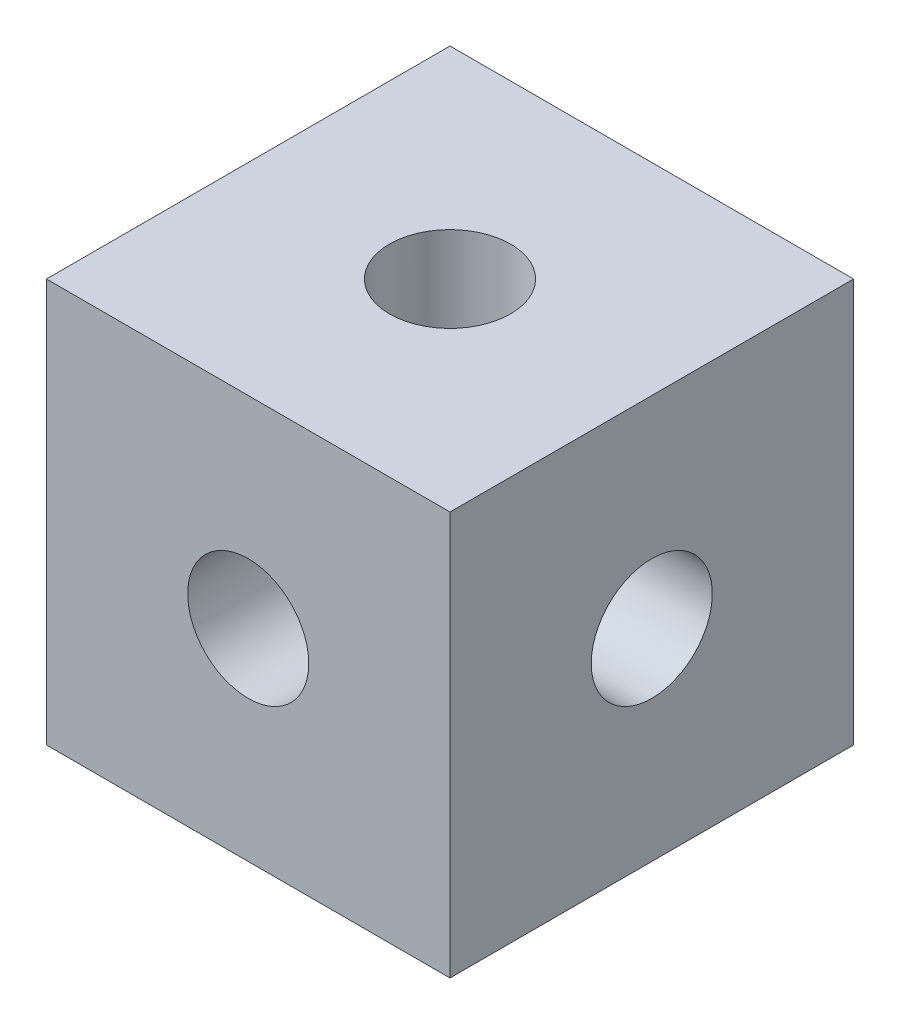
ISO-10303-21;
HEADER;
FILE_DESCRIPTION(('STEP AP214'),'2;1');
FILE_NAME('part.step','',(''),(''),'','','');
FILE_SCHEMA(('AUTOMOTIVE_DESIGN { 1 0 10303 214 1 1 1 1 }'));
ENDSEC;
DATA;
#1=APPLICATION_CONTEXT('core data for automotive mechanical design processes');
#2=APPLICATION_PROTOCOL_DEFINITION('international standard','automotive_design',2000,#1);
#3=PRODUCT_CONTEXT('',#1,'mechanical');
#4=PRODUCT('Part','Part','',(#3));
#5=PRODUCT_RELATED_PRODUCT_CATEGORY('part','',(#4));
#6=PRODUCT_DEFINITION_FORMATION('','',#4);
#7=PRODUCT_DEFINITION_CONTEXT('part definition',#1,'design');
#8=PRODUCT_DEFINITION('design','',#6,#7);
#9=PRODUCT_DEFINITION_SHAPE('','',#8);
#10=(LENGTH_UNIT() NAMED_UNIT(*) SI_UNIT(.MILLI.,.METRE.));
#11=(NAMED_UNIT(*) PLANE_ANGLE_UNIT() SI_UNIT($,.RADIAN.));
#12=(NAMED_UNIT(*) SI_UNIT($,.STERADIAN.) SOLID_ANGLE_UNIT());
#13=UNCERTAINTY_MEASURE_WITH_UNIT(LENGTH_MEASURE(1.E-05),#10,'distance_accuracy_value','');
#14=(GEOMETRIC_REPRESENTATION_CONTEXT(3) GLOBAL_UNCERTAINTY_ASSIGNED_CONTEXT((#13)) GLOBAL_UNIT_ASSIGNED_CONTEXT((#10,
#11,#12)) REPRESENTATION_CONTEXT('',''));
#15=CARTESIAN_POINT('',(0.,0.,0.));
#16=DIRECTION('',(0.,0.,1.));
#17=DIRECTION('',(1.,0.,0.));
#18=AXIS2_PLACEMENT_3D('',#15,#16,#17);
#19=CARTESIAN_POINT('',(0.,0.,10.));
#20=DIRECTION('',(0.,0.,-1.));
#21=DIRECTION('',(-1.,0.,0.));
#22=AXIS2_PLACEMENT_3D('',#19,#20,#21);
#23=CYLINDRICAL_SURFACE('',#22,1.5);
#24=CARTESIAN_POINT('',(0.,0.,5.));
#25=DIRECTION('',(-0.707106781186547,0.,-0.707106781186547));
#26=DIRECTION('',(0.707106781186547,0.,-0.707106781186547));
#27=AXIS2_PLACEMENT_3D('',#24,#25,#26);
#28=ELLIPSE('',#27,2.12132034355964,1.5);
#29=CARTESIAN_POINT('',(-1.06066017177982,1.06066017177982,6.06066017177982));
#30=VERTEX_POINT('',#29);
#31=CARTESIAN_POINT('',(-1.06066017177982,-1.06066017177982,6.06066017177982));
#32=VERTEX_POINT('',#31);
#33=EDGE_CURVE('E109',#30,#32,#28,.F.);
#34=ORIENTED_EDGE('',*,*,#33,.F.);
#35=CARTESIAN_POINT('',(0.,0.,5.));
#36=DIRECTION('',(0.,0.707106781186547,-0.707106781186547));
#37=DIRECTION('',(0.,-0.707106781186547,-0.707106781186547));
#38=AXIS2_PLACEMENT_3D('',#35,#36,#37);
#39=ELLIPSE('',#38,2.12132034355964,1.5);
#40=CARTESIAN_POINT('',(1.06066017177982,1.06066017177982,6.06066017177982));
#41=VERTEX_POINT('',#40);
#42=EDGE_CURVE('E116',#41,#30,#39,.F.);
#43=ORIENTED_EDGE('',*,*,#42,.F.);
#44=CARTESIAN_POINT('',(0.,0.,5.));
#45=DIRECTION('',(0.707106781186547,0.,-0.707106781186547));
#46=DIRECTION('',(-0.707106781186547,0.,-0.707106781186547));
#47=AXIS2_PLACEMENT_3D('',#44,#45,#46);
#48=ELLIPSE('',#47,2.12132034355964,1.5);
#49=CARTESIAN_POINT('',(1.06066017177982,-1.06066017177982,6.06066017177982));
#50=VERTEX_POINT('',#49);
#51=EDGE_CURVE('E69',#50,#41,#48,.F.);
#52=ORIENTED_EDGE('',*,*,#51,.F.);
#53=CARTESIAN_POINT('',(0.,0.,5.));
#54=DIRECTION('',(0.,-0.707106781186547,-0.707106781186547));
#55=DIRECTION('',(0.,0.707106781186547,-0.707106781186547));
#56=AXIS2_PLACEMENT_3D('',#53,#54,#55);
#57=ELLIPSE('',#56,2.12132034355964,1.5);
#58=EDGE_CURVE('E122',#32,#50,#57,.F.);
#59=ORIENTED_EDGE('',*,*,#58,.F.);
#60=EDGE_LOOP('',(#34,#43,#52,#59));
#61=FACE_BOUND('',#60,.T.);
#62=CARTESIAN_POINT('',(0.,0.,10.));
#63=DIRECTION('',(0.,0.,1.));
#64=DIRECTION('',(1.,0.,0.));
#65=AXIS2_PLACEMENT_3D('',#62,#63,#64);
#66=CIRCLE('',#65,1.5);
#67=CARTESIAN_POINT('',(1.5,0.,10.));
#68=VERTEX_POINT('',#67);
#69=EDGE_CURVE('E171',#68,#68,#66,.T.);
#70=ORIENTED_EDGE('',*,*,#69,.T.);
#71=EDGE_LOOP('',(#70));
#72=FACE_BOUND('',#71,.T.);
#73=ADVANCED_FACE('F45',(#61,#72),#23,.F.);
#74=CARTESIAN_POINT('',(0.,0.,10.));
#75=DIRECTION('',(0.,0.,-1.));
#76=DIRECTION('',(-1.,0.,0.));
#77=AXIS2_PLACEMENT_3D('',#74,#75,#76);
#78=PLANE('',#77);
#79=DIRECTION('',(0.,1.,0.));
#80=VECTOR('',#79,1.);
#81=CARTESIAN_POINT('',(5.,-5.,10.));
#82=LINE('',#81,#80);
#83=CARTESIAN_POINT('',(5.,-5.,10.));
#84=VERTEX_POINT('',#83);
#85=CARTESIAN_POINT('',(5.,5.,10.));
#86=VERTEX_POINT('',#85);
#87=EDGE_CURVE('E160',#84,#86,#82,.T.);
#88=ORIENTED_EDGE('',*,*,#87,.T.);
#89=DIRECTION('',(-1.,0.,0.));
#90=VECTOR('',#89,1.);
#91=CARTESIAN_POINT('',(-5.,5.,10.));
#92=LINE('',#91,#90);
#93=CARTESIAN_POINT('',(-5.,5.,10.));
#94=VERTEX_POINT('',#93);
#95=EDGE_CURVE('E177',#86,#94,#92,.T.);
#96=ORIENTED_EDGE('',*,*,#95,.T.);
#97=DIRECTION('',(0.,-1.,0.));
#98=VECTOR('',#97,1.);
#99=CARTESIAN_POINT('',(-5.,-5.,10.));
#100=LINE('',#99,#98);
#101=CARTESIAN_POINT('',(-5.,-5.,10.));
#102=VERTEX_POINT('',#101);
#103=EDGE_CURVE('E174',#94,#102,#100,.T.);
#104=ORIENTED_EDGE('',*,*,#103,.T.);
#105=DIRECTION('',(1.,0.,0.));
#106=VECTOR('',#105,1.);
#107=CARTESIAN_POINT('',(-5.,-5.,10.));
#108=LINE('',#107,#106);
#109=EDGE_CURVE('E156',#102,#84,#108,.T.);
#110=ORIENTED_EDGE('',*,*,#109,.T.);
#111=EDGE_LOOP('',(#88,#96,#104,#110));
#112=FACE_BOUND('',#111,.T.);
#113=ORIENTED_EDGE('',*,*,#69,.F.);
#114=EDGE_LOOP('',(#113));
#115=FACE_BOUND('',#114,.T.);
#116=ADVANCED_FACE('F231',(#112,#115),#78,.F.);
#117=CARTESIAN_POINT('',(0.,0.,0.));
#118=DIRECTION('',(0.,0.,-1.));
#119=DIRECTION('',(-1.,0.,0.));
#120=AXIS2_PLACEMENT_3D('',#117,#118,#119);
#121=PLANE('',#120);
#122=DIRECTION('',(0.,1.,0.));
#123=VECTOR('',#122,1.);
#124=CARTESIAN_POINT('',(5.,-5.,0.));
#125=LINE('',#124,#123);
#126=CARTESIAN_POINT('',(5.,-5.,0.));
#127=VERTEX_POINT('',#126);
#128=CARTESIAN_POINT('',(5.,5.,0.));
#129=VERTEX_POINT('',#128);
#130=EDGE_CURVE('E167',#127,#129,#125,.T.);
#131=ORIENTED_EDGE('',*,*,#130,.F.);
#132=DIRECTION('',(1.,0.,0.));
#133=VECTOR('',#132,1.);
#134=CARTESIAN_POINT('',(-5.,-5.,0.));
#135=LINE('',#134,#133);
#136=CARTESIAN_POINT('',(-5.,-5.,0.));
#137=VERTEX_POINT('',#136);
#138=EDGE_CURVE('E157',#137,#127,#135,.T.);
#139=ORIENTED_EDGE('',*,*,#138,.F.);
#140=DIRECTION('',(0.,-1.,0.));
#141=VECTOR('',#140,1.);
#142=CARTESIAN_POINT('',(-5.,-5.,0.));
#143=LINE('',#142,#141);
#144=CARTESIAN_POINT('',(-5.,5.,0.));
#145=VERTEX_POINT('',#144);
#146=EDGE_CURVE('E161',#145,#137,#143,.T.);
#147=ORIENTED_EDGE('',*,*,#146,.F.);
#148=DIRECTION('',(-1.,0.,0.));
#149=VECTOR('',#148,1.);
#150=CARTESIAN_POINT('',(-5.,5.,0.));
#151=LINE('',#150,#149);
#152=EDGE_CURVE('E164',#129,#145,#151,.T.);
#153=ORIENTED_EDGE('',*,*,#152,.F.);
#154=EDGE_LOOP('',(#131,#139,#147,#153));
#155=FACE_BOUND('',#154,.T.);
#156=CARTESIAN_POINT('',(0.,0.,0.));
#157=DIRECTION('',(0.,0.,1.));
#158=DIRECTION('',(1.,0.,0.));
#159=AXIS2_PLACEMENT_3D('',#156,#157,#158);
#160=CIRCLE('',#159,1.5);
#161=CARTESIAN_POINT('',(1.5,0.,0.));
#162=VERTEX_POINT('',#161);
#163=EDGE_CURVE('E183',#162,#162,#160,.T.);
#164=ORIENTED_EDGE('',*,*,#163,.T.);
#165=EDGE_LOOP('',(#164));
#166=FACE_BOUND('',#165,.T.);
#167=ADVANCED_FACE('F239',(#155,#166),#121,.T.);
#168=CARTESIAN_POINT('',(5.,-5.,10.));
#169=DIRECTION('',(-1.,0.,0.));
#170=DIRECTION('',(0.,0.,1.));
#171=AXIS2_PLACEMENT_3D('',#168,#169,#170);
#172=PLANE('',#171);
#173=CARTESIAN_POINT('',(5.,0.,5.));
#174=DIRECTION('',(-1.,0.,0.));
#175=DIRECTION('',(0.,0.,1.));
#176=AXIS2_PLACEMENT_3D('',#173,#174,#175);
#177=CIRCLE('',#176,1.5);
#178=CARTESIAN_POINT('',(5.,0.,6.5));
#179=VERTEX_POINT('',#178);
#180=EDGE_CURVE('E211',#179,#179,#177,.T.);
#181=ORIENTED_EDGE('',*,*,#180,.T.);
#182=EDGE_LOOP('',(#181));
#183=FACE_BOUND('',#182,.T.);
#184=ORIENTED_EDGE('',*,*,#130,.T.);
#185=DIRECTION('',(0.,0.,-1.));
#186=VECTOR('',#185,1.);
#187=CARTESIAN_POINT('',(5.,5.,10.));
#188=LINE('',#187,#186);
#189=EDGE_CURVE('E140',#86,#129,#188,.T.);
#190=ORIENTED_EDGE('',*,*,#189,.F.);
#191=ORIENTED_EDGE('',*,*,#87,.F.);
#192=DIRECTION('',(0.,0.,-1.));
#193=VECTOR('',#192,1.);
#194=CARTESIAN_POINT('',(5.,-5.,10.));
#195=LINE('',#194,#193);
#196=EDGE_CURVE('E152',#84,#127,#195,.T.);
#197=ORIENTED_EDGE('',*,*,#196,.T.);
#198=EDGE_LOOP('',(#184,#190,#191,#197));
#199=FACE_BOUND('',#198,.T.);
#200=ADVANCED_FACE('F47',(#183,#199),#172,.F.);
#201=CARTESIAN_POINT('',(-5.,5.,10.));
#202=DIRECTION('',(0.,-1.,0.));
#203=DIRECTION('',(0.,0.,-1.));
#204=AXIS2_PLACEMENT_3D('',#201,#202,#203);
#205=PLANE('',#204);
#206=CARTESIAN_POINT('',(0.,5.,5.));
#207=DIRECTION('',(0.,1.,0.));
#208=DIRECTION('',(0.,0.,1.));
#209=AXIS2_PLACEMENT_3D('',#206,#207,#208);
#210=CIRCLE('',#209,1.5);
#211=CARTESIAN_POINT('',(0.,5.,6.5));
#212=VERTEX_POINT('',#211);
#213=EDGE_CURVE('E191',#212,#212,#210,.T.);
#214=ORIENTED_EDGE('',*,*,#213,.F.);
#215=EDGE_LOOP('',(#214));
#216=FACE_BOUND('',#215,.T.);
#217=ORIENTED_EDGE('',*,*,#152,.T.);
#218=DIRECTION('',(0.,0.,-1.));
#219=VECTOR('',#218,1.);
#220=CARTESIAN_POINT('',(-5.,5.,10.));
#221=LINE('',#220,#219);
#222=EDGE_CURVE('E144',#94,#145,#221,.T.);
#223=ORIENTED_EDGE('',*,*,#222,.F.);
#224=ORIENTED_EDGE('',*,*,#95,.F.);
#225=ORIENTED_EDGE('',*,*,#189,.T.);
#226=EDGE_LOOP('',(#217,#223,#224,#225));
#227=FACE_BOUND('',#226,.T.);
#228=ADVANCED_FACE('F265',(#216,#227),#205,.F.);
#229=CARTESIAN_POINT('',(-5.,-5.,10.));
#230=DIRECTION('',(1.,0.,0.));
#231=DIRECTION('',(0.,0.,-1.));
#232=AXIS2_PLACEMENT_3D('',#229,#230,#231);
#233=PLANE('',#232);
#234=CARTESIAN_POINT('',(-5.,0.,5.));
#235=DIRECTION('',(-1.,0.,0.));
#236=DIRECTION('',(0.,0.,1.));
#237=AXIS2_PLACEMENT_3D('',#234,#235,#236);
#238=CIRCLE('',#237,1.5);
#239=CARTESIAN_POINT('',(-5.,0.,6.5));
#240=VERTEX_POINT('',#239);
#241=EDGE_CURVE('E212',#240,#240,#238,.T.);
#242=ORIENTED_EDGE('',*,*,#241,.F.);
#243=EDGE_LOOP('',(#242));
#244=FACE_BOUND('',#243,.T.);
#245=ORIENTED_EDGE('',*,*,#146,.T.);
#246=DIRECTION('',(0.,0.,-1.));
#247=VECTOR('',#246,1.);
#248=CARTESIAN_POINT('',(-5.,-5.,10.));
#249=LINE('',#248,#247);
#250=EDGE_CURVE('E148',#102,#137,#249,.T.);
#251=ORIENTED_EDGE('',*,*,#250,.F.);
#252=ORIENTED_EDGE('',*,*,#103,.F.);
#253=ORIENTED_EDGE('',*,*,#222,.T.);
#254=EDGE_LOOP('',(#245,#251,#252,#253));
#255=FACE_BOUND('',#254,.T.);
#256=ADVANCED_FACE('F251',(#244,#255),#233,.F.);
#257=CARTESIAN_POINT('',(-5.,-5.,10.));
#258=DIRECTION('',(0.,1.,0.));
#259=DIRECTION('',(0.,0.,1.));
#260=AXIS2_PLACEMENT_3D('',#257,#258,#259);
#261=PLANE('',#260);
#262=CARTESIAN_POINT('',(0.,-5.,5.));
#263=DIRECTION('',(0.,1.,0.));
#264=DIRECTION('',(0.,0.,1.));
#265=AXIS2_PLACEMENT_3D('',#262,#263,#264);
#266=CIRCLE('',#265,1.5);
#267=CARTESIAN_POINT('',(0.,-5.,6.5));
#268=VERTEX_POINT('',#267);
#269=EDGE_CURVE('E187',#268,#268,#266,.T.);
#270=ORIENTED_EDGE('',*,*,#269,.T.);
#271=EDGE_LOOP('',(#270));
#272=FACE_BOUND('',#271,.T.);
#273=ORIENTED_EDGE('',*,*,#138,.T.);
#274=ORIENTED_EDGE('',*,*,#196,.F.);
#275=ORIENTED_EDGE('',*,*,#109,.F.);
#276=ORIENTED_EDGE('',*,*,#250,.T.);
#277=EDGE_LOOP('',(#273,#274,#275,#276));
#278=FACE_BOUND('',#277,.T.);
#279=ADVANCED_FACE('F244',(#272,#278),#261,.F.);
#280=CARTESIAN_POINT('',(0.,0.,5.));
#281=DIRECTION('',(-0.707106781186547,0.,-0.707106781186547));
#282=DIRECTION('',(0.707106781186547,0.,-0.707106781186547));
#283=AXIS2_PLACEMENT_3D('',#280,#281,#282);
#284=ELLIPSE('',#283,2.12132034355964,1.5);
#285=CARTESIAN_POINT('',(1.06066017177982,1.06066017177982,3.93933982822018));
#286=VERTEX_POINT('',#285);
#287=CARTESIAN_POINT('',(1.06066017177982,-1.06066017177982,3.93933982822018));
#288=VERTEX_POINT('',#287);
#289=EDGE_CURVE('E204',#286,#288,#284,.T.);
#290=ORIENTED_EDGE('',*,*,#289,.F.);
#291=CARTESIAN_POINT('',(0.,0.,5.));
#292=DIRECTION('',(0.,-0.707106781186547,-0.707106781186547));
#293=DIRECTION('',(0.,0.707106781186547,-0.707106781186547));
#294=AXIS2_PLACEMENT_3D('',#291,#292,#293);
#295=ELLIPSE('',#294,2.12132034355964,1.5);
#296=CARTESIAN_POINT('',(-1.06066017177982,1.06066017177982,3.93933982822018));
#297=VERTEX_POINT('',#296);
#298=EDGE_CURVE('E133',#297,#286,#295,.T.);
#299=ORIENTED_EDGE('',*,*,#298,.F.);
#300=CARTESIAN_POINT('',(0.,0.,5.));
#301=DIRECTION('',(0.707106781186547,0.,-0.707106781186547));
#302=DIRECTION('',(-0.707106781186547,0.,-0.707106781186547));
#303=AXIS2_PLACEMENT_3D('',#300,#301,#302);
#304=ELLIPSE('',#303,2.12132034355964,1.5);
#305=CARTESIAN_POINT('',(-1.06066017177982,-1.06066017177982,3.93933982822018));
#306=VERTEX_POINT('',#305);
#307=EDGE_CURVE('E61',#306,#297,#304,.T.);
#308=ORIENTED_EDGE('',*,*,#307,.F.);
#309=CARTESIAN_POINT('',(0.,0.,5.));
#310=DIRECTION('',(0.,0.707106781186547,-0.707106781186547));
#311=DIRECTION('',(0.,-0.707106781186547,-0.707106781186547));
#312=AXIS2_PLACEMENT_3D('',#309,#310,#311);
#313=ELLIPSE('',#312,2.12132034355964,1.5);
#314=EDGE_CURVE('E129',#288,#306,#313,.T.);
#315=ORIENTED_EDGE('',*,*,#314,.F.);
#316=EDGE_LOOP('',(#290,#299,#308,#315));
#317=FACE_BOUND('',#316,.T.);
#318=ORIENTED_EDGE('',*,*,#163,.F.);
#319=EDGE_LOOP('',(#318));
#320=FACE_BOUND('',#319,.T.);
#321=ADVANCED_FACE('F233',(#317,#320),#23,.F.);
#322=CARTESIAN_POINT('',(0.,-5.,5.));
#323=DIRECTION('',(0.,1.,0.));
#324=DIRECTION('',(0.,0.,1.));
#325=AXIS2_PLACEMENT_3D('',#322,#323,#324);
#326=CYLINDRICAL_SURFACE('',#325,1.5);
#327=ORIENTED_EDGE('',*,*,#314,.T.);
#328=CARTESIAN_POINT('',(0.,0.,5.));
#329=DIRECTION('',(-0.707106781186547,0.707106781186547,0.));
#330=DIRECTION('',(0.707106781186547,0.707106781186547,0.));
#331=AXIS2_PLACEMENT_3D('',#328,#329,#330);
#332=ELLIPSE('',#331,2.12132034355964,1.5);
#333=EDGE_CURVE('E124',#306,#32,#332,.T.);
#334=ORIENTED_EDGE('',*,*,#333,.T.);
#335=ORIENTED_EDGE('',*,*,#58,.T.);
#336=CARTESIAN_POINT('',(0.,0.,5.));
#337=DIRECTION('',(0.707106781186547,0.707106781186547,0.));
#338=DIRECTION('',(-0.707106781186547,0.707106781186547,0.));
#339=AXIS2_PLACEMENT_3D('',#336,#337,#338);
#340=ELLIPSE('',#339,2.12132034355964,1.5);
#341=EDGE_CURVE('E195',#50,#288,#340,.T.);
#342=ORIENTED_EDGE('',*,*,#341,.T.);
#343=EDGE_LOOP('',(#327,#334,#335,#342));
#344=FACE_BOUND('',#343,.T.);
#345=ORIENTED_EDGE('',*,*,#269,.F.);
#346=EDGE_LOOP('',(#345));
#347=FACE_BOUND('',#346,.T.);
#348=ADVANCED_FACE('F243',(#344,#347),#326,.F.);
#349=ORIENTED_EDGE('',*,*,#298,.T.);
#350=CARTESIAN_POINT('',(0.,0.,5.));
#351=DIRECTION('',(-0.707106781186547,0.707106781186547,0.));
#352=DIRECTION('',(0.707106781186547,0.707106781186547,0.));
#353=AXIS2_PLACEMENT_3D('',#350,#351,#352);
#354=ELLIPSE('',#353,2.12132034355964,1.5);
#355=EDGE_CURVE('E11',#286,#41,#354,.F.);
#356=ORIENTED_EDGE('',*,*,#355,.T.);
#357=ORIENTED_EDGE('',*,*,#42,.T.);
#358=CARTESIAN_POINT('',(0.,0.,5.));
#359=DIRECTION('',(0.707106781186547,0.707106781186547,0.));
#360=DIRECTION('',(-0.707106781186547,0.707106781186547,0.));
#361=AXIS2_PLACEMENT_3D('',#358,#359,#360);
#362=ELLIPSE('',#361,2.12132034355964,1.5);
#363=EDGE_CURVE('E54',#30,#297,#362,.F.);
#364=ORIENTED_EDGE('',*,*,#363,.T.);
#365=EDGE_LOOP('',(#349,#356,#357,#364));
#366=FACE_BOUND('',#365,.T.);
#367=ORIENTED_EDGE('',*,*,#213,.T.);
#368=EDGE_LOOP('',(#367));
#369=FACE_BOUND('',#368,.T.);
#370=ADVANCED_FACE('F126',(#366,#369),#326,.F.);
#371=CARTESIAN_POINT('',(5.,0.,5.));
#372=DIRECTION('',(-1.,0.,0.));
#373=DIRECTION('',(0.,0.,1.));
#374=AXIS2_PLACEMENT_3D('',#371,#372,#373);
#375=CYLINDRICAL_SURFACE('',#374,1.5);
#376=ORIENTED_EDGE('',*,*,#241,.T.);
#377=EDGE_LOOP('',(#376));
#378=FACE_BOUND('',#377,.T.);
#379=ORIENTED_EDGE('',*,*,#307,.T.);
#380=ORIENTED_EDGE('',*,*,#363,.F.);
#381=ORIENTED_EDGE('',*,*,#33,.T.);
#382=ORIENTED_EDGE('',*,*,#333,.F.);
#383=EDGE_LOOP('',(#379,#380,#381,#382));
#384=FACE_BOUND('',#383,.T.);
#385=ADVANCED_FACE('F108',(#378,#384),#375,.F.);
#386=ORIENTED_EDGE('',*,*,#180,.F.);
#387=EDGE_LOOP('',(#386));
#388=FACE_BOUND('',#387,.T.);
#389=ORIENTED_EDGE('',*,*,#51,.T.);
#390=ORIENTED_EDGE('',*,*,#355,.F.);
#391=ORIENTED_EDGE('',*,*,#289,.T.);
#392=ORIENTED_EDGE('',*,*,#341,.F.);
#393=EDGE_LOOP('',(#389,#390,#391,#392));
#394=FACE_BOUND('',#393,.T.);
#395=ADVANCED_FACE('F222',(#388,#394),#375,.F.);
#396=CLOSED_SHELL('',(#73,#116,#167,#200,#228,#256,#279,#321,#348,#370,#385,#395));
#397=MANIFOLD_SOLID_BREP('B2',#396);
#398=ADVANCED_BREP_SHAPE_REPRESENTATION('',(#18,#397),#14);
#399=SHAPE_DEFINITION_REPRESENTATION(#9,#398);
ENDSEC;
END-ISO-10303-21;
